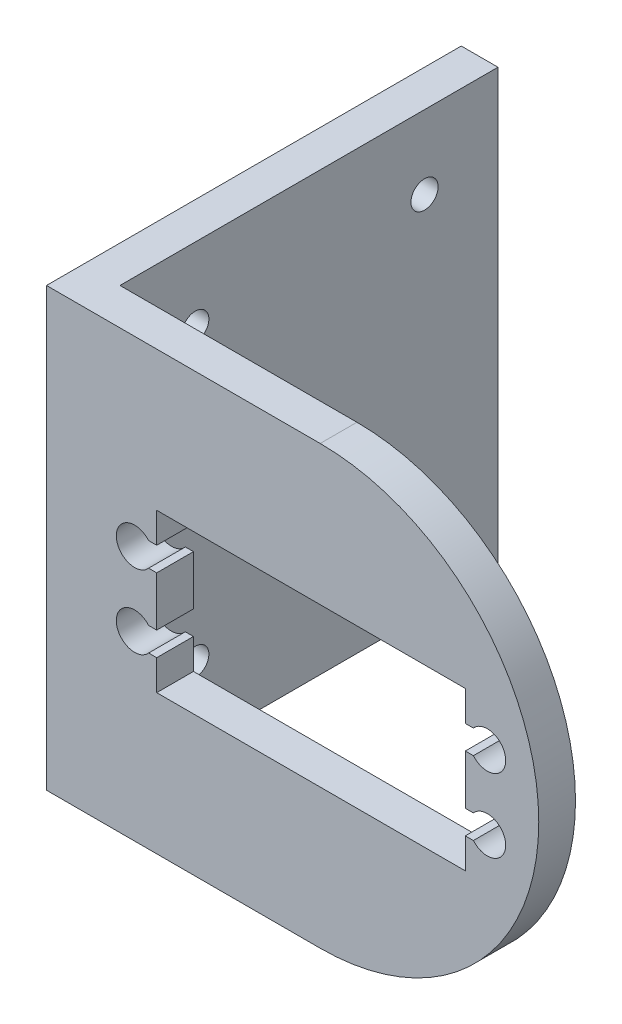
ISO-10303-21;
HEADER;
FILE_DESCRIPTION(('STEP AP214'),'2;1');
FILE_NAME('part.step','',(''),(''),'','','');
FILE_SCHEMA(('AUTOMOTIVE_DESIGN { 1 0 10303 214 1 1 1 1 }'));
ENDSEC;
DATA;
#1=APPLICATION_CONTEXT('core data for automotive mechanical design processes');
#2=APPLICATION_PROTOCOL_DEFINITION('international standard','automotive_design',2000,#1);
#3=PRODUCT_CONTEXT('',#1,'mechanical');
#4=PRODUCT('Part','Part','',(#3));
#5=PRODUCT_RELATED_PRODUCT_CATEGORY('part','',(#4));
#6=PRODUCT_DEFINITION_FORMATION('','',#4);
#7=PRODUCT_DEFINITION_CONTEXT('part definition',#1,'design');
#8=PRODUCT_DEFINITION('design','',#6,#7);
#9=PRODUCT_DEFINITION_SHAPE('','',#8);
#10=(LENGTH_UNIT() NAMED_UNIT(*) SI_UNIT(.MILLI.,.METRE.));
#11=(NAMED_UNIT(*) PLANE_ANGLE_UNIT() SI_UNIT($,.RADIAN.));
#12=(NAMED_UNIT(*) SI_UNIT($,.STERADIAN.) SOLID_ANGLE_UNIT());
#13=UNCERTAINTY_MEASURE_WITH_UNIT(LENGTH_MEASURE(1.E-05),#10,'distance_accuracy_value','');
#14=(GEOMETRIC_REPRESENTATION_CONTEXT(3) GLOBAL_UNCERTAINTY_ASSIGNED_CONTEXT((#13)) GLOBAL_UNIT_ASSIGNED_CONTEXT((#10,
#11,#12)) REPRESENTATION_CONTEXT('',''));
#15=CARTESIAN_POINT('',(0.,0.,0.));
#16=DIRECTION('',(0.,0.,1.));
#17=DIRECTION('',(1.,0.,0.));
#18=AXIS2_PLACEMENT_3D('',#15,#16,#17);
#19=CARTESIAN_POINT('',(1.25000000000001,0.,5.));
#20=DIRECTION('',(0.,0.,-1.));
#21=DIRECTION('',(-1.,0.,0.));
#22=AXIS2_PLACEMENT_3D('',#19,#20,#21);
#23=CYLINDRICAL_SURFACE('',#22,29.75);
#24=DIRECTION('',(0.,0.,-1.));
#25=VECTOR('',#24,1.);
#26=CARTESIAN_POINT('',(1.25000000000002,29.75,5.));
#27=LINE('',#26,#25);
#28=CARTESIAN_POINT('',(1.25000000000002,29.75,5.));
#29=VERTEX_POINT('',#28);
#30=CARTESIAN_POINT('',(1.25000000000004,29.75,0.));
#31=VERTEX_POINT('',#30);
#32=EDGE_CURVE('E214',#29,#31,#27,.T.);
#33=ORIENTED_EDGE('',*,*,#32,.F.);
#34=CARTESIAN_POINT('',(1.25000000000001,0.,5.));
#35=DIRECTION('',(0.,0.,1.));
#36=DIRECTION('',(1.,0.,0.));
#37=AXIS2_PLACEMENT_3D('',#34,#35,#36);
#38=CIRCLE('',#37,29.75);
#39=CARTESIAN_POINT('',(1.25000000000003,-29.75,5.));
#40=VERTEX_POINT('',#39);
#41=EDGE_CURVE('E43',#40,#29,#38,.T.);
#42=ORIENTED_EDGE('',*,*,#41,.F.);
#43=DIRECTION('',(0.,0.,-1.));
#44=VECTOR('',#43,1.);
#45=CARTESIAN_POINT('',(1.25000000000004,-29.75,5.));
#46=LINE('',#45,#44);
#47=CARTESIAN_POINT('',(1.25000000000001,-29.75,0.));
#48=VERTEX_POINT('',#47);
#49=EDGE_CURVE('E410',#48,#40,#46,.F.);
#50=ORIENTED_EDGE('',*,*,#49,.F.);
#51=CARTESIAN_POINT('',(1.25000000000001,0.,0.));
#52=DIRECTION('',(0.,0.,1.));
#53=DIRECTION('',(1.,0.,0.));
#54=AXIS2_PLACEMENT_3D('',#51,#52,#53);
#55=CIRCLE('',#54,29.75);
#56=EDGE_CURVE('E11',#31,#48,#55,.F.);
#57=ORIENTED_EDGE('',*,*,#56,.F.);
#58=EDGE_LOOP('',(#33,#42,#50,#57));
#59=FACE_BOUND('',#58,.T.);
#60=ADVANCED_FACE('F35',(#59),#23,.T.);
#61=CARTESIAN_POINT('',(0.,0.,5.));
#62=DIRECTION('',(0.,0.,1.));
#63=DIRECTION('',(1.,0.,0.));
#64=AXIS2_PLACEMENT_3D('',#61,#62,#63);
#65=PLANE('',#64);
#66=DIRECTION('',(1.,0.,0.));
#67=VECTOR('',#66,1.);
#68=CARTESIAN_POINT('',(-31.,-29.75,5.));
#69=LINE('',#68,#67);
#70=CARTESIAN_POINT('',(-36.,-29.75,5.));
#71=VERTEX_POINT('',#70);
#72=EDGE_CURVE('E215',#71,#40,#69,.T.);
#73=ORIENTED_EDGE('',*,*,#72,.T.);
#74=ORIENTED_EDGE('',*,*,#41,.T.);
#75=DIRECTION('',(-1.,0.,0.));
#76=VECTOR('',#75,1.);
#77=CARTESIAN_POINT('',(31.,29.75,5.));
#78=LINE('',#77,#76);
#79=CARTESIAN_POINT('',(-36.,29.75,5.));
#80=VERTEX_POINT('',#79);
#81=EDGE_CURVE('E205',#29,#80,#78,.T.);
#82=ORIENTED_EDGE('',*,*,#81,.T.);
#83=DIRECTION('',(0.,1.,0.));
#84=VECTOR('',#83,1.);
#85=CARTESIAN_POINT('',(-36.,29.75,5.));
#86=LINE('',#85,#84);
#87=EDGE_CURVE('E211',#71,#80,#86,.T.);
#88=ORIENTED_EDGE('',*,*,#87,.F.);
#89=EDGE_LOOP('',(#73,#74,#82,#88));
#90=FACE_BOUND('',#89,.T.);
#91=DIRECTION('',(1.,0.,0.));
#92=VECTOR('',#91,1.);
#93=CARTESIAN_POINT('',(-22.1001644808037,3.37499999999999,5.));
#94=LINE('',#93,#92);
#95=CARTESIAN_POINT('',(-22.1001644808037,3.37499999999999,5.));
#96=VERTEX_POINT('',#95);
#97=CARTESIAN_POINT('',(-21.,3.37499999999999,5.));
#98=VERTEX_POINT('',#97);
#99=EDGE_CURVE('E253',#96,#98,#94,.T.);
#100=ORIENTED_EDGE('',*,*,#99,.F.);
#101=CARTESIAN_POINT('',(-24.,5.,5.));
#102=DIRECTION('',(0.,0.,1.));
#103=DIRECTION('',(1.,0.,0.));
#104=AXIS2_PLACEMENT_3D('',#101,#102,#103);
#105=CIRCLE('',#104,2.5);
#106=CARTESIAN_POINT('',(-22.1001644808037,6.62500000000001,5.));
#107=VERTEX_POINT('',#106);
#108=EDGE_CURVE('E251',#107,#96,#105,.T.);
#109=ORIENTED_EDGE('',*,*,#108,.F.);
#110=DIRECTION('',(-1.,0.,0.));
#111=VECTOR('',#110,1.);
#112=CARTESIAN_POINT('',(-22.1001644808037,6.62500000000001,5.));
#113=LINE('',#112,#111);
#114=CARTESIAN_POINT('',(-21.,6.62500000000001,5.));
#115=VERTEX_POINT('',#114);
#116=EDGE_CURVE('E291',#115,#107,#113,.T.);
#117=ORIENTED_EDGE('',*,*,#116,.F.);
#118=DIRECTION('',(0.,-1.,0.));
#119=VECTOR('',#118,1.);
#120=CARTESIAN_POINT('',(-21.,10.75,5.));
#121=LINE('',#120,#119);
#122=CARTESIAN_POINT('',(-21.,10.75,5.));
#123=VERTEX_POINT('',#122);
#124=EDGE_CURVE('E288',#123,#115,#121,.T.);
#125=ORIENTED_EDGE('',*,*,#124,.F.);
#126=DIRECTION('',(-1.,0.,0.));
#127=VECTOR('',#126,1.);
#128=CARTESIAN_POINT('',(-21.,10.75,5.));
#129=LINE('',#128,#127);
#130=CARTESIAN_POINT('',(21.0357876746711,10.75,5.));
#131=VERTEX_POINT('',#130);
#132=EDGE_CURVE('E286',#131,#123,#129,.T.);
#133=ORIENTED_EDGE('',*,*,#132,.F.);
#134=DIRECTION('',(0.00867547342712313,0.9999623673723,0.));
#135=VECTOR('',#134,1.);
#136=CARTESIAN_POINT('',(21.0357876746711,10.75,5.));
#137=LINE('',#136,#135);
#138=CARTESIAN_POINT('',(21.,6.62500000000001,5.));
#139=VERTEX_POINT('',#138);
#140=EDGE_CURVE('E284',#139,#131,#137,.T.);
#141=ORIENTED_EDGE('',*,*,#140,.F.);
#142=DIRECTION('',(-1.,0.,0.));
#143=VECTOR('',#142,1.);
#144=CARTESIAN_POINT('',(22.1001644808037,6.62500000000001,5.));
#145=LINE('',#144,#143);
#146=CARTESIAN_POINT('',(22.1001644808037,6.62500000000001,5.));
#147=VERTEX_POINT('',#146);
#148=EDGE_CURVE('E282',#147,#139,#145,.T.);
#149=ORIENTED_EDGE('',*,*,#148,.F.);
#150=CARTESIAN_POINT('',(24.,5.,5.));
#151=DIRECTION('',(0.,0.,1.));
#152=DIRECTION('',(-1.,0.,0.));
#153=AXIS2_PLACEMENT_3D('',#150,#151,#152);
#154=CIRCLE('',#153,2.5);
#155=CARTESIAN_POINT('',(22.1001644808037,3.37499999999999,5.));
#156=VERTEX_POINT('',#155);
#157=EDGE_CURVE('E280',#156,#147,#154,.T.);
#158=ORIENTED_EDGE('',*,*,#157,.F.);
#159=DIRECTION('',(1.,0.,0.));
#160=VECTOR('',#159,1.);
#161=CARTESIAN_POINT('',(22.1001644808037,3.37499999999999,5.));
#162=LINE('',#161,#160);
#163=CARTESIAN_POINT('',(21.,3.37499999999999,5.));
#164=VERTEX_POINT('',#163);
#165=EDGE_CURVE('E278',#164,#156,#162,.T.);
#166=ORIENTED_EDGE('',*,*,#165,.F.);
#167=DIRECTION('',(0.,1.,0.));
#168=VECTOR('',#167,1.);
#169=CARTESIAN_POINT('',(21.,3.37499999999999,5.));
#170=LINE('',#169,#168);
#171=CARTESIAN_POINT('',(21.,-3.37499999999998,5.));
#172=VERTEX_POINT('',#171);
#173=EDGE_CURVE('E276',#172,#164,#170,.T.);
#174=ORIENTED_EDGE('',*,*,#173,.F.);
#175=DIRECTION('',(-1.,0.,0.));
#176=VECTOR('',#175,1.);
#177=CARTESIAN_POINT('',(22.1001644808037,-3.37499999999998,5.));
#178=LINE('',#177,#176);
#179=CARTESIAN_POINT('',(22.1001644808037,-3.37499999999998,5.));
#180=VERTEX_POINT('',#179);
#181=EDGE_CURVE('E274',#180,#172,#178,.T.);
#182=ORIENTED_EDGE('',*,*,#181,.F.);
#183=CARTESIAN_POINT('',(24.,-4.99999999999999,5.));
#184=DIRECTION('',(0.,0.,1.));
#185=DIRECTION('',(1.,0.,0.));
#186=AXIS2_PLACEMENT_3D('',#183,#184,#185);
#187=CIRCLE('',#186,2.5);
#188=CARTESIAN_POINT('',(22.1001644808037,-6.625,5.));
#189=VERTEX_POINT('',#188);
#190=EDGE_CURVE('E272',#189,#180,#187,.T.);
#191=ORIENTED_EDGE('',*,*,#190,.F.);
#192=DIRECTION('',(1.,0.,0.));
#193=VECTOR('',#192,1.);
#194=CARTESIAN_POINT('',(22.1001644808037,-6.625,5.));
#195=LINE('',#194,#193);
#196=CARTESIAN_POINT('',(21.,-6.62499999999999,5.));
#197=VERTEX_POINT('',#196);
#198=EDGE_CURVE('E270',#197,#189,#195,.T.);
#199=ORIENTED_EDGE('',*,*,#198,.F.);
#200=DIRECTION('',(0.,1.,0.));
#201=VECTOR('',#200,1.);
#202=CARTESIAN_POINT('',(21.,-6.62499999999999,5.));
#203=LINE('',#202,#201);
#204=CARTESIAN_POINT('',(21.,-10.75,5.));
#205=VERTEX_POINT('',#204);
#206=EDGE_CURVE('E268',#205,#197,#203,.T.);
#207=ORIENTED_EDGE('',*,*,#206,.F.);
#208=DIRECTION('',(1.,0.,0.));
#209=VECTOR('',#208,1.);
#210=CARTESIAN_POINT('',(-21.,-10.75,5.));
#211=LINE('',#210,#209);
#212=CARTESIAN_POINT('',(-21.,-10.75,5.));
#213=VERTEX_POINT('',#212);
#214=EDGE_CURVE('E266',#213,#205,#211,.T.);
#215=ORIENTED_EDGE('',*,*,#214,.F.);
#216=DIRECTION('',(0.,-1.,0.));
#217=VECTOR('',#216,1.);
#218=CARTESIAN_POINT('',(-21.,-6.62499999999999,5.));
#219=LINE('',#218,#217);
#220=CARTESIAN_POINT('',(-21.,-6.62499999999999,5.));
#221=VERTEX_POINT('',#220);
#222=EDGE_CURVE('E264',#221,#213,#219,.T.);
#223=ORIENTED_EDGE('',*,*,#222,.F.);
#224=DIRECTION('',(1.,0.,0.));
#225=VECTOR('',#224,1.);
#226=CARTESIAN_POINT('',(-22.1001644808037,-6.625,5.));
#227=LINE('',#226,#225);
#228=CARTESIAN_POINT('',(-22.1001644808037,-6.625,5.));
#229=VERTEX_POINT('',#228);
#230=EDGE_CURVE('E262',#229,#221,#227,.T.);
#231=ORIENTED_EDGE('',*,*,#230,.F.);
#232=CARTESIAN_POINT('',(-24.,-4.99999999999999,5.));
#233=DIRECTION('',(0.,0.,1.));
#234=DIRECTION('',(-1.,0.,0.));
#235=AXIS2_PLACEMENT_3D('',#232,#233,#234);
#236=CIRCLE('',#235,2.5);
#237=CARTESIAN_POINT('',(-22.1001644808037,-3.37499999999998,5.));
#238=VERTEX_POINT('',#237);
#239=EDGE_CURVE('E260',#238,#229,#236,.T.);
#240=ORIENTED_EDGE('',*,*,#239,.F.);
#241=DIRECTION('',(-1.,0.,0.));
#242=VECTOR('',#241,1.);
#243=CARTESIAN_POINT('',(-22.1001644808037,-3.37499999999998,5.));
#244=LINE('',#243,#242);
#245=CARTESIAN_POINT('',(-21.,-3.37499999999998,5.));
#246=VERTEX_POINT('',#245);
#247=EDGE_CURVE('E258',#246,#238,#244,.T.);
#248=ORIENTED_EDGE('',*,*,#247,.F.);
#249=DIRECTION('',(0.,-1.,0.));
#250=VECTOR('',#249,1.);
#251=CARTESIAN_POINT('',(-21.,3.37499999999999,5.));
#252=LINE('',#251,#250);
#253=EDGE_CURVE('E256',#98,#246,#252,.T.);
#254=ORIENTED_EDGE('',*,*,#253,.F.);
#255=EDGE_LOOP('',(#100,#109,#117,#125,#133,#141,#149,#158,#166,#174,#182,#191,#199,#207,#215,
#223,#231,#240,#248,#254));
#256=FACE_BOUND('',#255,.T.);
#257=ADVANCED_FACE('F208',(#90,#256),#65,.T.);
#258=CARTESIAN_POINT('',(0.,0.,0.));
#259=DIRECTION('',(0.,0.,1.));
#260=DIRECTION('',(1.,0.,0.));
#261=AXIS2_PLACEMENT_3D('',#258,#259,#260);
#262=PLANE('',#261);
#263=DIRECTION('',(-1.,0.,0.));
#264=VECTOR('',#263,1.);
#265=CARTESIAN_POINT('',(-31.,29.75,0.));
#266=LINE('',#265,#264);
#267=CARTESIAN_POINT('',(-31.,29.75,0.));
#268=VERTEX_POINT('',#267);
#269=EDGE_CURVE('E395',#31,#268,#266,.T.);
#270=ORIENTED_EDGE('',*,*,#269,.F.);
#271=ORIENTED_EDGE('',*,*,#56,.T.);
#272=DIRECTION('',(1.,0.,0.));
#273=VECTOR('',#272,1.);
#274=CARTESIAN_POINT('',(31.,-29.75,0.));
#275=LINE('',#274,#273);
#276=CARTESIAN_POINT('',(-31.,-29.75,0.));
#277=VERTEX_POINT('',#276);
#278=EDGE_CURVE('E401',#277,#48,#275,.T.);
#279=ORIENTED_EDGE('',*,*,#278,.F.);
#280=DIRECTION('',(0.,-1.,0.));
#281=VECTOR('',#280,1.);
#282=CARTESIAN_POINT('',(-31.,29.75,0.));
#283=LINE('',#282,#281);
#284=EDGE_CURVE('E394',#268,#277,#283,.T.);
#285=ORIENTED_EDGE('',*,*,#284,.F.);
#286=EDGE_LOOP('',(#270,#271,#279,#285));
#287=FACE_BOUND('',#286,.T.);
#288=CARTESIAN_POINT('',(-24.,5.,0.));
#289=DIRECTION('',(0.,0.,1.));
#290=DIRECTION('',(1.,0.,0.));
#291=AXIS2_PLACEMENT_3D('',#288,#289,#290);
#292=CIRCLE('',#291,2.5);
#293=CARTESIAN_POINT('',(-22.1001644808037,6.62500000000001,0.));
#294=VERTEX_POINT('',#293);
#295=CARTESIAN_POINT('',(-22.1001644808037,3.37499999999999,0.));
#296=VERTEX_POINT('',#295);
#297=EDGE_CURVE('E294',#294,#296,#292,.T.);
#298=ORIENTED_EDGE('',*,*,#297,.T.);
#299=DIRECTION('',(1.,0.,0.));
#300=VECTOR('',#299,1.);
#301=CARTESIAN_POINT('',(-22.1001644808037,3.37499999999999,0.));
#302=LINE('',#301,#300);
#303=CARTESIAN_POINT('',(-21.,3.37499999999999,0.));
#304=VERTEX_POINT('',#303);
#305=EDGE_CURVE('E297',#296,#304,#302,.T.);
#306=ORIENTED_EDGE('',*,*,#305,.T.);
#307=DIRECTION('',(0.,-1.,0.));
#308=VECTOR('',#307,1.);
#309=CARTESIAN_POINT('',(-21.,3.37499999999999,0.));
#310=LINE('',#309,#308);
#311=CARTESIAN_POINT('',(-21.,-3.37499999999998,0.));
#312=VERTEX_POINT('',#311);
#313=EDGE_CURVE('E300',#304,#312,#310,.T.);
#314=ORIENTED_EDGE('',*,*,#313,.T.);
#315=DIRECTION('',(-1.,0.,0.));
#316=VECTOR('',#315,1.);
#317=CARTESIAN_POINT('',(-22.1001644808037,-3.37499999999998,0.));
#318=LINE('',#317,#316);
#319=CARTESIAN_POINT('',(-22.1001644808037,-3.37499999999998,0.));
#320=VERTEX_POINT('',#319);
#321=EDGE_CURVE('E303',#312,#320,#318,.T.);
#322=ORIENTED_EDGE('',*,*,#321,.T.);
#323=CARTESIAN_POINT('',(-24.,-4.99999999999999,0.));
#324=DIRECTION('',(0.,0.,1.));
#325=DIRECTION('',(-1.,0.,0.));
#326=AXIS2_PLACEMENT_3D('',#323,#324,#325);
#327=CIRCLE('',#326,2.5);
#328=CARTESIAN_POINT('',(-22.1001644808037,-6.625,0.));
#329=VERTEX_POINT('',#328);
#330=EDGE_CURVE('E306',#320,#329,#327,.T.);
#331=ORIENTED_EDGE('',*,*,#330,.T.);
#332=DIRECTION('',(1.,0.,0.));
#333=VECTOR('',#332,1.);
#334=CARTESIAN_POINT('',(-22.1001644808037,-6.625,0.));
#335=LINE('',#334,#333);
#336=CARTESIAN_POINT('',(-21.,-6.62499999999999,0.));
#337=VERTEX_POINT('',#336);
#338=EDGE_CURVE('E309',#329,#337,#335,.T.);
#339=ORIENTED_EDGE('',*,*,#338,.T.);
#340=DIRECTION('',(0.,-1.,0.));
#341=VECTOR('',#340,1.);
#342=CARTESIAN_POINT('',(-21.,-6.62499999999999,0.));
#343=LINE('',#342,#341);
#344=CARTESIAN_POINT('',(-21.,-10.75,0.));
#345=VERTEX_POINT('',#344);
#346=EDGE_CURVE('E312',#337,#345,#343,.T.);
#347=ORIENTED_EDGE('',*,*,#346,.T.);
#348=DIRECTION('',(1.,0.,0.));
#349=VECTOR('',#348,1.);
#350=CARTESIAN_POINT('',(-21.,-10.75,0.));
#351=LINE('',#350,#349);
#352=CARTESIAN_POINT('',(21.,-10.75,0.));
#353=VERTEX_POINT('',#352);
#354=EDGE_CURVE('E315',#345,#353,#351,.T.);
#355=ORIENTED_EDGE('',*,*,#354,.T.);
#356=DIRECTION('',(0.,1.,0.));
#357=VECTOR('',#356,1.);
#358=CARTESIAN_POINT('',(21.,-6.62499999999999,0.));
#359=LINE('',#358,#357);
#360=CARTESIAN_POINT('',(21.,-6.62499999999999,0.));
#361=VERTEX_POINT('',#360);
#362=EDGE_CURVE('E318',#353,#361,#359,.T.);
#363=ORIENTED_EDGE('',*,*,#362,.T.);
#364=DIRECTION('',(1.,0.,0.));
#365=VECTOR('',#364,1.);
#366=CARTESIAN_POINT('',(22.1001644808037,-6.625,0.));
#367=LINE('',#366,#365);
#368=CARTESIAN_POINT('',(22.1001644808037,-6.625,0.));
#369=VERTEX_POINT('',#368);
#370=EDGE_CURVE('E321',#361,#369,#367,.T.);
#371=ORIENTED_EDGE('',*,*,#370,.T.);
#372=CARTESIAN_POINT('',(24.,-4.99999999999999,0.));
#373=DIRECTION('',(0.,0.,1.));
#374=DIRECTION('',(1.,0.,0.));
#375=AXIS2_PLACEMENT_3D('',#372,#373,#374);
#376=CIRCLE('',#375,2.5);
#377=CARTESIAN_POINT('',(22.1001644808037,-3.37499999999998,0.));
#378=VERTEX_POINT('',#377);
#379=EDGE_CURVE('E324',#369,#378,#376,.T.);
#380=ORIENTED_EDGE('',*,*,#379,.T.);
#381=DIRECTION('',(-1.,0.,0.));
#382=VECTOR('',#381,1.);
#383=CARTESIAN_POINT('',(22.1001644808037,-3.37499999999998,0.));
#384=LINE('',#383,#382);
#385=CARTESIAN_POINT('',(21.,-3.37499999999998,0.));
#386=VERTEX_POINT('',#385);
#387=EDGE_CURVE('E327',#378,#386,#384,.T.);
#388=ORIENTED_EDGE('',*,*,#387,.T.);
#389=DIRECTION('',(0.,1.,0.));
#390=VECTOR('',#389,1.);
#391=CARTESIAN_POINT('',(21.,3.37499999999999,0.));
#392=LINE('',#391,#390);
#393=CARTESIAN_POINT('',(21.,3.37499999999999,0.));
#394=VERTEX_POINT('',#393);
#395=EDGE_CURVE('E330',#386,#394,#392,.T.);
#396=ORIENTED_EDGE('',*,*,#395,.T.);
#397=DIRECTION('',(1.,0.,0.));
#398=VECTOR('',#397,1.);
#399=CARTESIAN_POINT('',(22.1001644808037,3.37499999999999,0.));
#400=LINE('',#399,#398);
#401=CARTESIAN_POINT('',(22.1001644808037,3.37499999999999,0.));
#402=VERTEX_POINT('',#401);
#403=EDGE_CURVE('E333',#394,#402,#400,.T.);
#404=ORIENTED_EDGE('',*,*,#403,.T.);
#405=CARTESIAN_POINT('',(24.,5.,0.));
#406=DIRECTION('',(0.,0.,1.));
#407=DIRECTION('',(-1.,0.,0.));
#408=AXIS2_PLACEMENT_3D('',#405,#406,#407);
#409=CIRCLE('',#408,2.5);
#410=CARTESIAN_POINT('',(22.1001644808037,6.62500000000001,0.));
#411=VERTEX_POINT('',#410);
#412=EDGE_CURVE('E336',#402,#411,#409,.T.);
#413=ORIENTED_EDGE('',*,*,#412,.T.);
#414=DIRECTION('',(-1.,0.,0.));
#415=VECTOR('',#414,1.);
#416=CARTESIAN_POINT('',(22.1001644808037,6.62500000000001,0.));
#417=LINE('',#416,#415);
#418=CARTESIAN_POINT('',(21.,6.62500000000001,0.));
#419=VERTEX_POINT('',#418);
#420=EDGE_CURVE('E339',#411,#419,#417,.T.);
#421=ORIENTED_EDGE('',*,*,#420,.T.);
#422=DIRECTION('',(0.00867547342712313,0.9999623673723,0.));
#423=VECTOR('',#422,1.);
#424=CARTESIAN_POINT('',(21.0357876746711,10.75,0.));
#425=LINE('',#424,#423);
#426=CARTESIAN_POINT('',(21.0357876746711,10.75,0.));
#427=VERTEX_POINT('',#426);
#428=EDGE_CURVE('E342',#419,#427,#425,.T.);
#429=ORIENTED_EDGE('',*,*,#428,.T.);
#430=DIRECTION('',(-1.,0.,0.));
#431=VECTOR('',#430,1.);
#432=CARTESIAN_POINT('',(-21.,10.75,0.));
#433=LINE('',#432,#431);
#434=CARTESIAN_POINT('',(-21.,10.75,0.));
#435=VERTEX_POINT('',#434);
#436=EDGE_CURVE('E345',#427,#435,#433,.T.);
#437=ORIENTED_EDGE('',*,*,#436,.T.);
#438=DIRECTION('',(0.,-1.,0.));
#439=VECTOR('',#438,1.);
#440=CARTESIAN_POINT('',(-21.,10.75,0.));
#441=LINE('',#440,#439);
#442=CARTESIAN_POINT('',(-21.,6.62500000000001,0.));
#443=VERTEX_POINT('',#442);
#444=EDGE_CURVE('E348',#435,#443,#441,.T.);
#445=ORIENTED_EDGE('',*,*,#444,.T.);
#446=DIRECTION('',(-1.,0.,0.));
#447=VECTOR('',#446,1.);
#448=CARTESIAN_POINT('',(-22.1001644808037,6.62500000000001,0.));
#449=LINE('',#448,#447);
#450=EDGE_CURVE('E254',#443,#294,#449,.T.);
#451=ORIENTED_EDGE('',*,*,#450,.T.);
#452=EDGE_LOOP('',(#298,#306,#314,#322,#331,#339,#347,#355,#363,#371,#380,#388,#396,#404,#413,
#421,#429,#437,#445,#451));
#453=FACE_BOUND('',#452,.T.);
#454=ADVANCED_FACE('F414',(#287,#453),#262,.F.);
#455=CARTESIAN_POINT('',(31.,-29.75,5.));
#456=DIRECTION('',(0.,1.,0.));
#457=DIRECTION('',(-1.,0.,0.));
#458=AXIS2_PLACEMENT_3D('',#455,#456,#457);
#459=PLANE('',#458);
#460=ORIENTED_EDGE('',*,*,#278,.T.);
#461=ORIENTED_EDGE('',*,*,#49,.T.);
#462=ORIENTED_EDGE('',*,*,#72,.F.);
#463=DIRECTION('',(0.,0.,1.));
#464=VECTOR('',#463,1.);
#465=CARTESIAN_POINT('',(-36.,-29.75,5.));
#466=LINE('',#465,#464);
#467=CARTESIAN_POINT('',(-36.,-29.75,-51.45));
#468=VERTEX_POINT('',#467);
#469=EDGE_CURVE('E230',#468,#71,#466,.T.);
#470=ORIENTED_EDGE('',*,*,#469,.F.);
#471=DIRECTION('',(1.,0.,0.));
#472=VECTOR('',#471,1.);
#473=CARTESIAN_POINT('',(-36.,-29.75,-51.45));
#474=LINE('',#473,#472);
#475=CARTESIAN_POINT('',(-31.,-29.75,-51.45));
#476=VERTEX_POINT('',#475);
#477=EDGE_CURVE('E242',#468,#476,#474,.T.);
#478=ORIENTED_EDGE('',*,*,#477,.T.);
#479=DIRECTION('',(0.,0.,1.));
#480=VECTOR('',#479,1.);
#481=CARTESIAN_POINT('',(-31.,-29.75,5.));
#482=LINE('',#481,#480);
#483=EDGE_CURVE('E231',#476,#277,#482,.T.);
#484=ORIENTED_EDGE('',*,*,#483,.T.);
#485=EDGE_LOOP('',(#460,#461,#462,#470,#478,#484));
#486=FACE_BOUND('',#485,.T.);
#487=ADVANCED_FACE('F412',(#486),#459,.F.);
#488=CARTESIAN_POINT('',(-31.,29.75,5.));
#489=DIRECTION('',(0.,-1.,0.));
#490=DIRECTION('',(1.,0.,0.));
#491=AXIS2_PLACEMENT_3D('',#488,#489,#490);
#492=PLANE('',#491);
#493=ORIENTED_EDGE('',*,*,#81,.F.);
#494=ORIENTED_EDGE('',*,*,#32,.T.);
#495=ORIENTED_EDGE('',*,*,#269,.T.);
#496=DIRECTION('',(0.,0.,-1.));
#497=VECTOR('',#496,1.);
#498=CARTESIAN_POINT('',(-31.,29.75,5.));
#499=LINE('',#498,#497);
#500=CARTESIAN_POINT('',(-31.,29.75,-51.45));
#501=VERTEX_POINT('',#500);
#502=EDGE_CURVE('E247',#268,#501,#499,.T.);
#503=ORIENTED_EDGE('',*,*,#502,.T.);
#504=DIRECTION('',(1.,0.,0.));
#505=VECTOR('',#504,1.);
#506=CARTESIAN_POINT('',(-36.,29.75,-51.45));
#507=LINE('',#506,#505);
#508=CARTESIAN_POINT('',(-36.,29.75,-51.45));
#509=VERTEX_POINT('',#508);
#510=EDGE_CURVE('E221',#509,#501,#507,.T.);
#511=ORIENTED_EDGE('',*,*,#510,.F.);
#512=DIRECTION('',(0.,0.,-1.));
#513=VECTOR('',#512,1.);
#514=CARTESIAN_POINT('',(-36.,29.75,5.));
#515=LINE('',#514,#513);
#516=EDGE_CURVE('E218',#80,#509,#515,.T.);
#517=ORIENTED_EDGE('',*,*,#516,.F.);
#518=EDGE_LOOP('',(#493,#494,#495,#503,#511,#517));
#519=FACE_BOUND('',#518,.T.);
#520=ADVANCED_FACE('F219',(#519),#492,.F.);
#521=CARTESIAN_POINT('',(-24.,5.,5.));
#522=DIRECTION('',(0.,0.,-1.));
#523=DIRECTION('',(-1.,0.,0.));
#524=AXIS2_PLACEMENT_3D('',#521,#522,#523);
#525=CYLINDRICAL_SURFACE('',#524,2.5);
#526=ORIENTED_EDGE('',*,*,#297,.F.);
#527=DIRECTION('',(0.,0.,-1.));
#528=VECTOR('',#527,1.);
#529=CARTESIAN_POINT('',(-22.1001644808037,6.62500000000001,5.));
#530=LINE('',#529,#528);
#531=EDGE_CURVE('E293',#107,#294,#530,.T.);
#532=ORIENTED_EDGE('',*,*,#531,.F.);
#533=ORIENTED_EDGE('',*,*,#108,.T.);
#534=DIRECTION('',(0.,0.,-1.));
#535=VECTOR('',#534,1.);
#536=CARTESIAN_POINT('',(-22.1001644808037,3.37499999999999,5.));
#537=LINE('',#536,#535);
#538=EDGE_CURVE('E391',#96,#296,#537,.T.);
#539=ORIENTED_EDGE('',*,*,#538,.T.);
#540=EDGE_LOOP('',(#526,#532,#533,#539));
#541=FACE_BOUND('',#540,.T.);
#542=ADVANCED_FACE('F453',(#541),#525,.F.);
#543=CARTESIAN_POINT('',(-22.1001644808037,3.37499999999999,5.));
#544=DIRECTION('',(0.,1.,0.));
#545=DIRECTION('',(0.,0.,1.));
#546=AXIS2_PLACEMENT_3D('',#543,#544,#545);
#547=PLANE('',#546);
#548=ORIENTED_EDGE('',*,*,#305,.F.);
#549=ORIENTED_EDGE('',*,*,#538,.F.);
#550=ORIENTED_EDGE('',*,*,#99,.T.);
#551=DIRECTION('',(0.,0.,-1.));
#552=VECTOR('',#551,1.);
#553=CARTESIAN_POINT('',(-21.,3.37499999999999,5.));
#554=LINE('',#553,#552);
#555=EDGE_CURVE('E389',#98,#304,#554,.T.);
#556=ORIENTED_EDGE('',*,*,#555,.T.);
#557=EDGE_LOOP('',(#548,#549,#550,#556));
#558=FACE_BOUND('',#557,.T.);
#559=ADVANCED_FACE('F539',(#558),#547,.T.);
#560=CARTESIAN_POINT('',(-21.,3.37499999999999,5.));
#561=DIRECTION('',(1.,0.,0.));
#562=DIRECTION('',(0.,0.,-1.));
#563=AXIS2_PLACEMENT_3D('',#560,#561,#562);
#564=PLANE('',#563);
#565=ORIENTED_EDGE('',*,*,#313,.F.);
#566=ORIENTED_EDGE('',*,*,#555,.F.);
#567=ORIENTED_EDGE('',*,*,#253,.T.);
#568=DIRECTION('',(0.,0.,-1.));
#569=VECTOR('',#568,1.);
#570=CARTESIAN_POINT('',(-21.,-3.37499999999998,5.));
#571=LINE('',#570,#569);
#572=EDGE_CURVE('E387',#246,#312,#571,.T.);
#573=ORIENTED_EDGE('',*,*,#572,.T.);
#574=EDGE_LOOP('',(#565,#566,#567,#573));
#575=FACE_BOUND('',#574,.T.);
#576=ADVANCED_FACE('F546',(#575),#564,.T.);
#577=CARTESIAN_POINT('',(-22.1001644808037,-3.37499999999998,5.));
#578=DIRECTION('',(0.,-1.,0.));
#579=DIRECTION('',(1.,0.,0.));
#580=AXIS2_PLACEMENT_3D('',#577,#578,#579);
#581=PLANE('',#580);
#582=ORIENTED_EDGE('',*,*,#321,.F.);
#583=ORIENTED_EDGE('',*,*,#572,.F.);
#584=ORIENTED_EDGE('',*,*,#247,.T.);
#585=DIRECTION('',(0.,0.,-1.));
#586=VECTOR('',#585,1.);
#587=CARTESIAN_POINT('',(-22.1001644808037,-3.37499999999998,5.));
#588=LINE('',#587,#586);
#589=EDGE_CURVE('E385',#238,#320,#588,.T.);
#590=ORIENTED_EDGE('',*,*,#589,.T.);
#591=EDGE_LOOP('',(#582,#583,#584,#590));
#592=FACE_BOUND('',#591,.T.);
#593=ADVANCED_FACE('F553',(#592),#581,.T.);
#594=CARTESIAN_POINT('',(-24.,-4.99999999999999,5.));
#595=DIRECTION('',(0.,0.,-1.));
#596=DIRECTION('',(-1.,0.,0.));
#597=AXIS2_PLACEMENT_3D('',#594,#595,#596);
#598=CYLINDRICAL_SURFACE('',#597,2.5);
#599=ORIENTED_EDGE('',*,*,#330,.F.);
#600=ORIENTED_EDGE('',*,*,#589,.F.);
#601=ORIENTED_EDGE('',*,*,#239,.T.);
#602=DIRECTION('',(0.,0.,-1.));
#603=VECTOR('',#602,1.);
#604=CARTESIAN_POINT('',(-22.1001644808037,-6.625,5.));
#605=LINE('',#604,#603);
#606=EDGE_CURVE('E383',#229,#329,#605,.T.);
#607=ORIENTED_EDGE('',*,*,#606,.T.);
#608=EDGE_LOOP('',(#599,#600,#601,#607));
#609=FACE_BOUND('',#608,.T.);
#610=ADVANCED_FACE('F561',(#609),#598,.F.);
#611=CARTESIAN_POINT('',(-22.1001644808037,-6.625,5.));
#612=DIRECTION('',(0.,1.,0.));
#613=DIRECTION('',(-1.,0.,0.));
#614=AXIS2_PLACEMENT_3D('',#611,#612,#613);
#615=PLANE('',#614);
#616=ORIENTED_EDGE('',*,*,#338,.F.);
#617=ORIENTED_EDGE('',*,*,#606,.F.);
#618=ORIENTED_EDGE('',*,*,#230,.T.);
#619=DIRECTION('',(0.,0.,-1.));
#620=VECTOR('',#619,1.);
#621=CARTESIAN_POINT('',(-21.,-6.62499999999999,5.));
#622=LINE('',#621,#620);
#623=EDGE_CURVE('E381',#221,#337,#622,.T.);
#624=ORIENTED_EDGE('',*,*,#623,.T.);
#625=EDGE_LOOP('',(#616,#617,#618,#624));
#626=FACE_BOUND('',#625,.T.);
#627=ADVANCED_FACE('F569',(#626),#615,.T.);
#628=CARTESIAN_POINT('',(-21.,-6.62499999999999,5.));
#629=DIRECTION('',(1.,0.,0.));
#630=DIRECTION('',(0.,0.,-1.));
#631=AXIS2_PLACEMENT_3D('',#628,#629,#630);
#632=PLANE('',#631);
#633=ORIENTED_EDGE('',*,*,#346,.F.);
#634=ORIENTED_EDGE('',*,*,#623,.F.);
#635=ORIENTED_EDGE('',*,*,#222,.T.);
#636=DIRECTION('',(0.,0.,-1.));
#637=VECTOR('',#636,1.);
#638=CARTESIAN_POINT('',(-21.,-10.75,5.));
#639=LINE('',#638,#637);
#640=EDGE_CURVE('E379',#213,#345,#639,.T.);
#641=ORIENTED_EDGE('',*,*,#640,.T.);
#642=EDGE_LOOP('',(#633,#634,#635,#641));
#643=FACE_BOUND('',#642,.T.);
#644=ADVANCED_FACE('F577',(#643),#632,.T.);
#645=CARTESIAN_POINT('',(-21.,-10.75,5.));
#646=DIRECTION('',(0.,1.,0.));
#647=DIRECTION('',(-1.,0.,0.));
#648=AXIS2_PLACEMENT_3D('',#645,#646,#647);
#649=PLANE('',#648);
#650=ORIENTED_EDGE('',*,*,#354,.F.);
#651=ORIENTED_EDGE('',*,*,#640,.F.);
#652=ORIENTED_EDGE('',*,*,#214,.T.);
#653=DIRECTION('',(0.,0.,-1.));
#654=VECTOR('',#653,1.);
#655=CARTESIAN_POINT('',(21.,-10.75,5.));
#656=LINE('',#655,#654);
#657=EDGE_CURVE('E377',#205,#353,#656,.T.);
#658=ORIENTED_EDGE('',*,*,#657,.T.);
#659=EDGE_LOOP('',(#650,#651,#652,#658));
#660=FACE_BOUND('',#659,.T.);
#661=ADVANCED_FACE('F585',(#660),#649,.T.);
#662=CARTESIAN_POINT('',(21.,-6.62499999999999,5.));
#663=DIRECTION('',(-1.,0.,0.));
#664=DIRECTION('',(0.,-1.,0.));
#665=AXIS2_PLACEMENT_3D('',#662,#663,#664);
#666=PLANE('',#665);
#667=ORIENTED_EDGE('',*,*,#362,.F.);
#668=ORIENTED_EDGE('',*,*,#657,.F.);
#669=ORIENTED_EDGE('',*,*,#206,.T.);
#670=DIRECTION('',(0.,0.,-1.));
#671=VECTOR('',#670,1.);
#672=CARTESIAN_POINT('',(21.,-6.62499999999999,5.));
#673=LINE('',#672,#671);
#674=EDGE_CURVE('E375',#197,#361,#673,.T.);
#675=ORIENTED_EDGE('',*,*,#674,.T.);
#676=EDGE_LOOP('',(#667,#668,#669,#675));
#677=FACE_BOUND('',#676,.T.);
#678=ADVANCED_FACE('F593',(#677),#666,.T.);
#679=CARTESIAN_POINT('',(22.1001644808037,-6.625,5.));
#680=DIRECTION('',(0.,1.,0.));
#681=DIRECTION('',(-1.,0.,0.));
#682=AXIS2_PLACEMENT_3D('',#679,#680,#681);
#683=PLANE('',#682);
#684=ORIENTED_EDGE('',*,*,#370,.F.);
#685=ORIENTED_EDGE('',*,*,#674,.F.);
#686=ORIENTED_EDGE('',*,*,#198,.T.);
#687=DIRECTION('',(0.,0.,-1.));
#688=VECTOR('',#687,1.);
#689=CARTESIAN_POINT('',(22.1001644808037,-6.625,5.));
#690=LINE('',#689,#688);
#691=EDGE_CURVE('E373',#189,#369,#690,.T.);
#692=ORIENTED_EDGE('',*,*,#691,.T.);
#693=EDGE_LOOP('',(#684,#685,#686,#692));
#694=FACE_BOUND('',#693,.T.);
#695=ADVANCED_FACE('F601',(#694),#683,.T.);
#696=CARTESIAN_POINT('',(24.,-4.99999999999999,5.));
#697=DIRECTION('',(0.,0.,-1.));
#698=DIRECTION('',(-1.,0.,0.));
#699=AXIS2_PLACEMENT_3D('',#696,#697,#698);
#700=CYLINDRICAL_SURFACE('',#699,2.5);
#701=ORIENTED_EDGE('',*,*,#379,.F.);
#702=ORIENTED_EDGE('',*,*,#691,.F.);
#703=ORIENTED_EDGE('',*,*,#190,.T.);
#704=DIRECTION('',(0.,0.,-1.));
#705=VECTOR('',#704,1.);
#706=CARTESIAN_POINT('',(22.1001644808037,-3.37499999999998,5.));
#707=LINE('',#706,#705);
#708=EDGE_CURVE('E371',#180,#378,#707,.T.);
#709=ORIENTED_EDGE('',*,*,#708,.T.);
#710=EDGE_LOOP('',(#701,#702,#703,#709));
#711=FACE_BOUND('',#710,.T.);
#712=ADVANCED_FACE('F609',(#711),#700,.F.);
#713=CARTESIAN_POINT('',(22.1001644808037,-3.37499999999998,5.));
#714=DIRECTION('',(0.,-1.,0.));
#715=DIRECTION('',(1.,0.,0.));
#716=AXIS2_PLACEMENT_3D('',#713,#714,#715);
#717=PLANE('',#716);
#718=ORIENTED_EDGE('',*,*,#387,.F.);
#719=ORIENTED_EDGE('',*,*,#708,.F.);
#720=ORIENTED_EDGE('',*,*,#181,.T.);
#721=DIRECTION('',(0.,0.,-1.));
#722=VECTOR('',#721,1.);
#723=CARTESIAN_POINT('',(21.,-3.37499999999998,5.));
#724=LINE('',#723,#722);
#725=EDGE_CURVE('E369',#172,#386,#724,.T.);
#726=ORIENTED_EDGE('',*,*,#725,.T.);
#727=EDGE_LOOP('',(#718,#719,#720,#726));
#728=FACE_BOUND('',#727,.T.);
#729=ADVANCED_FACE('F617',(#728),#717,.T.);
#730=CARTESIAN_POINT('',(21.,3.37499999999999,5.));
#731=DIRECTION('',(-1.,0.,0.));
#732=DIRECTION('',(0.,0.,1.));
#733=AXIS2_PLACEMENT_3D('',#730,#731,#732);
#734=PLANE('',#733);
#735=ORIENTED_EDGE('',*,*,#395,.F.);
#736=ORIENTED_EDGE('',*,*,#725,.F.);
#737=ORIENTED_EDGE('',*,*,#173,.T.);
#738=DIRECTION('',(0.,0.,-1.));
#739=VECTOR('',#738,1.);
#740=CARTESIAN_POINT('',(21.,3.37499999999999,5.));
#741=LINE('',#740,#739);
#742=EDGE_CURVE('E367',#164,#394,#741,.T.);
#743=ORIENTED_EDGE('',*,*,#742,.T.);
#744=EDGE_LOOP('',(#735,#736,#737,#743));
#745=FACE_BOUND('',#744,.T.);
#746=ADVANCED_FACE('F625',(#745),#734,.T.);
#747=CARTESIAN_POINT('',(22.1001644808037,3.37499999999999,5.));
#748=DIRECTION('',(0.,1.,0.));
#749=DIRECTION('',(0.,0.,1.));
#750=AXIS2_PLACEMENT_3D('',#747,#748,#749);
#751=PLANE('',#750);
#752=ORIENTED_EDGE('',*,*,#403,.F.);
#753=ORIENTED_EDGE('',*,*,#742,.F.);
#754=ORIENTED_EDGE('',*,*,#165,.T.);
#755=DIRECTION('',(0.,0.,-1.));
#756=VECTOR('',#755,1.);
#757=CARTESIAN_POINT('',(22.1001644808037,3.37499999999999,5.));
#758=LINE('',#757,#756);
#759=EDGE_CURVE('E365',#156,#402,#758,.T.);
#760=ORIENTED_EDGE('',*,*,#759,.T.);
#761=EDGE_LOOP('',(#752,#753,#754,#760));
#762=FACE_BOUND('',#761,.T.);
#763=ADVANCED_FACE('F633',(#762),#751,.T.);
#764=CARTESIAN_POINT('',(24.,5.,5.));
#765=DIRECTION('',(0.,0.,-1.));
#766=DIRECTION('',(-1.,0.,0.));
#767=AXIS2_PLACEMENT_3D('',#764,#765,#766);
#768=CYLINDRICAL_SURFACE('',#767,2.5);
#769=ORIENTED_EDGE('',*,*,#412,.F.);
#770=ORIENTED_EDGE('',*,*,#759,.F.);
#771=ORIENTED_EDGE('',*,*,#157,.T.);
#772=DIRECTION('',(0.,0.,-1.));
#773=VECTOR('',#772,1.);
#774=CARTESIAN_POINT('',(22.1001644808037,6.62500000000001,5.));
#775=LINE('',#774,#773);
#776=EDGE_CURVE('E363',#147,#411,#775,.T.);
#777=ORIENTED_EDGE('',*,*,#776,.T.);
#778=EDGE_LOOP('',(#769,#770,#771,#777));
#779=FACE_BOUND('',#778,.T.);
#780=ADVANCED_FACE('F641',(#779),#768,.F.);
#781=CARTESIAN_POINT('',(22.1001644808037,6.62500000000001,5.));
#782=DIRECTION('',(0.,-1.,0.));
#783=DIRECTION('',(0.,0.,-1.));
#784=AXIS2_PLACEMENT_3D('',#781,#782,#783);
#785=PLANE('',#784);
#786=ORIENTED_EDGE('',*,*,#420,.F.);
#787=ORIENTED_EDGE('',*,*,#776,.F.);
#788=ORIENTED_EDGE('',*,*,#148,.T.);
#789=DIRECTION('',(0.,0.,-1.));
#790=VECTOR('',#789,1.);
#791=CARTESIAN_POINT('',(21.,6.62500000000001,5.));
#792=LINE('',#791,#790);
#793=EDGE_CURVE('E361',#139,#419,#792,.T.);
#794=ORIENTED_EDGE('',*,*,#793,.T.);
#795=EDGE_LOOP('',(#786,#787,#788,#794));
#796=FACE_BOUND('',#795,.T.);
#797=ADVANCED_FACE('F649',(#796),#785,.T.);
#798=CARTESIAN_POINT('',(21.0357876746711,10.75,5.));
#799=DIRECTION('',(-0.9999623673723,0.00867547342712313,0.));
#800=DIRECTION('',(-0.00867547342712313,-0.9999623673723,0.));
#801=AXIS2_PLACEMENT_3D('',#798,#799,#800);
#802=PLANE('',#801);
#803=ORIENTED_EDGE('',*,*,#428,.F.);
#804=ORIENTED_EDGE('',*,*,#793,.F.);
#805=ORIENTED_EDGE('',*,*,#140,.T.);
#806=DIRECTION('',(0.,0.,-1.));
#807=VECTOR('',#806,1.);
#808=CARTESIAN_POINT('',(21.0357876746711,10.75,5.));
#809=LINE('',#808,#807);
#810=EDGE_CURVE('E359',#131,#427,#809,.T.);
#811=ORIENTED_EDGE('',*,*,#810,.T.);
#812=EDGE_LOOP('',(#803,#804,#805,#811));
#813=FACE_BOUND('',#812,.T.);
#814=ADVANCED_FACE('F657',(#813),#802,.T.);
#815=CARTESIAN_POINT('',(-21.,10.75,5.));
#816=DIRECTION('',(0.,-1.,0.));
#817=DIRECTION('',(0.,0.,-1.));
#818=AXIS2_PLACEMENT_3D('',#815,#816,#817);
#819=PLANE('',#818);
#820=ORIENTED_EDGE('',*,*,#436,.F.);
#821=ORIENTED_EDGE('',*,*,#810,.F.);
#822=ORIENTED_EDGE('',*,*,#132,.T.);
#823=DIRECTION('',(0.,0.,-1.));
#824=VECTOR('',#823,1.);
#825=CARTESIAN_POINT('',(-21.,10.75,5.));
#826=LINE('',#825,#824);
#827=EDGE_CURVE('E357',#123,#435,#826,.T.);
#828=ORIENTED_EDGE('',*,*,#827,.T.);
#829=EDGE_LOOP('',(#820,#821,#822,#828));
#830=FACE_BOUND('',#829,.T.);
#831=ADVANCED_FACE('F665',(#830),#819,.T.);
#832=CARTESIAN_POINT('',(-21.,10.75,5.));
#833=DIRECTION('',(1.,0.,0.));
#834=DIRECTION('',(0.,0.,-1.));
#835=AXIS2_PLACEMENT_3D('',#832,#833,#834);
#836=PLANE('',#835);
#837=ORIENTED_EDGE('',*,*,#444,.F.);
#838=ORIENTED_EDGE('',*,*,#827,.F.);
#839=ORIENTED_EDGE('',*,*,#124,.T.);
#840=DIRECTION('',(0.,0.,-1.));
#841=VECTOR('',#840,1.);
#842=CARTESIAN_POINT('',(-21.,6.62500000000001,5.));
#843=LINE('',#842,#841);
#844=EDGE_CURVE('E355',#115,#443,#843,.T.);
#845=ORIENTED_EDGE('',*,*,#844,.T.);
#846=EDGE_LOOP('',(#837,#838,#839,#845));
#847=FACE_BOUND('',#846,.T.);
#848=ADVANCED_FACE('F673',(#847),#836,.T.);
#849=CARTESIAN_POINT('',(-22.1001644808037,6.62500000000001,5.));
#850=DIRECTION('',(0.,-1.,0.));
#851=DIRECTION('',(0.,0.,-1.));
#852=AXIS2_PLACEMENT_3D('',#849,#850,#851);
#853=PLANE('',#852);
#854=ORIENTED_EDGE('',*,*,#450,.F.);
#855=ORIENTED_EDGE('',*,*,#844,.F.);
#856=ORIENTED_EDGE('',*,*,#116,.T.);
#857=ORIENTED_EDGE('',*,*,#531,.T.);
#858=EDGE_LOOP('',(#854,#855,#856,#857));
#859=FACE_BOUND('',#858,.T.);
#860=ADVANCED_FACE('F468',(#859),#853,.T.);
#861=CARTESIAN_POINT('',(-36.,0.,0.));
#862=DIRECTION('',(1.,0.,0.));
#863=DIRECTION('',(0.,1.,0.));
#864=AXIS2_PLACEMENT_3D('',#861,#862,#863);
#865=PLANE('',#864);
#866=ORIENTED_EDGE('',*,*,#87,.T.);
#867=ORIENTED_EDGE('',*,*,#516,.T.);
#868=DIRECTION('',(0.,-1.,0.));
#869=VECTOR('',#868,1.);
#870=CARTESIAN_POINT('',(-36.,-29.75,-51.45));
#871=LINE('',#870,#869);
#872=EDGE_CURVE('E224',#509,#468,#871,.T.);
#873=ORIENTED_EDGE('',*,*,#872,.T.);
#874=ORIENTED_EDGE('',*,*,#469,.T.);
#875=EDGE_LOOP('',(#866,#867,#873,#874));
#876=FACE_BOUND('',#875,.T.);
#877=CARTESIAN_POINT('',(-36.,19.75,-41.45));
#878=DIRECTION('',(-1.,0.,0.));
#879=DIRECTION('',(0.,-1.,0.));
#880=AXIS2_PLACEMENT_3D('',#877,#878,#879);
#881=CIRCLE('',#880,1.85);
#882=CARTESIAN_POINT('',(-36.,17.9,-41.45));
#883=VERTEX_POINT('',#882);
#884=EDGE_CURVE('E249',#883,#883,#881,.T.);
#885=ORIENTED_EDGE('',*,*,#884,.F.);
#886=EDGE_LOOP('',(#885));
#887=FACE_BOUND('',#886,.T.);
#888=CARTESIAN_POINT('',(-36.,-19.75,-41.45));
#889=DIRECTION('',(-1.,0.,0.));
#890=DIRECTION('',(0.,1.,0.));
#891=AXIS2_PLACEMENT_3D('',#888,#889,#890);
#892=CIRCLE('',#891,1.85);
#893=CARTESIAN_POINT('',(-36.,-17.9,-41.45));
#894=VERTEX_POINT('',#893);
#895=EDGE_CURVE('E827',#894,#894,#892,.T.);
#896=ORIENTED_EDGE('',*,*,#895,.F.);
#897=EDGE_LOOP('',(#896));
#898=FACE_BOUND('',#897,.T.);
#899=CARTESIAN_POINT('',(-36.,-19.75,-10.25));
#900=DIRECTION('',(-1.,0.,0.));
#901=DIRECTION('',(0.,-1.,0.));
#902=AXIS2_PLACEMENT_3D('',#899,#900,#901);
#903=CIRCLE('',#902,1.85);
#904=CARTESIAN_POINT('',(-36.,-21.6,-10.25));
#905=VERTEX_POINT('',#904);
#906=EDGE_CURVE('E821',#905,#905,#903,.T.);
#907=ORIENTED_EDGE('',*,*,#906,.F.);
#908=EDGE_LOOP('',(#907));
#909=FACE_BOUND('',#908,.T.);
#910=CARTESIAN_POINT('',(-36.,19.75,-10.25));
#911=DIRECTION('',(-1.,0.,0.));
#912=DIRECTION('',(0.,1.,0.));
#913=AXIS2_PLACEMENT_3D('',#910,#911,#912);
#914=CIRCLE('',#913,1.85);
#915=CARTESIAN_POINT('',(-36.,21.6,-10.25));
#916=VERTEX_POINT('',#915);
#917=EDGE_CURVE('E812',#916,#916,#914,.T.);
#918=ORIENTED_EDGE('',*,*,#917,.F.);
#919=EDGE_LOOP('',(#918));
#920=FACE_BOUND('',#919,.T.);
#921=ADVANCED_FACE('F227',(#876,#887,#898,#909,#920),#865,.F.);
#922=CARTESIAN_POINT('',(-31.,0.,0.));
#923=DIRECTION('',(1.,0.,0.));
#924=DIRECTION('',(0.,1.,0.));
#925=AXIS2_PLACEMENT_3D('',#922,#923,#924);
#926=PLANE('',#925);
#927=CARTESIAN_POINT('',(-31.,-19.75,-10.25));
#928=DIRECTION('',(-1.,0.,0.));
#929=DIRECTION('',(0.,-1.,0.));
#930=AXIS2_PLACEMENT_3D('',#927,#928,#929);
#931=CIRCLE('',#930,1.85);
#932=CARTESIAN_POINT('',(-31.,-21.6,-10.25));
#933=VERTEX_POINT('',#932);
#934=EDGE_CURVE('E818',#933,#933,#931,.T.);
#935=ORIENTED_EDGE('',*,*,#934,.T.);
#936=EDGE_LOOP('',(#935));
#937=FACE_BOUND('',#936,.T.);
#938=CARTESIAN_POINT('',(-31.,19.75,-41.45));
#939=DIRECTION('',(-1.,0.,0.));
#940=DIRECTION('',(0.,-1.,0.));
#941=AXIS2_PLACEMENT_3D('',#938,#939,#940);
#942=CIRCLE('',#941,1.85);
#943=CARTESIAN_POINT('',(-31.,17.9,-41.45));
#944=VERTEX_POINT('',#943);
#945=EDGE_CURVE('E237',#944,#944,#942,.T.);
#946=ORIENTED_EDGE('',*,*,#945,.T.);
#947=EDGE_LOOP('',(#946));
#948=FACE_BOUND('',#947,.T.);
#949=ORIENTED_EDGE('',*,*,#502,.F.);
#950=ORIENTED_EDGE('',*,*,#284,.T.);
#951=ORIENTED_EDGE('',*,*,#483,.F.);
#952=DIRECTION('',(0.,-1.,0.));
#953=VECTOR('',#952,1.);
#954=CARTESIAN_POINT('',(-31.,-29.75,-51.45));
#955=LINE('',#954,#953);
#956=EDGE_CURVE('E234',#501,#476,#955,.T.);
#957=ORIENTED_EDGE('',*,*,#956,.F.);
#958=EDGE_LOOP('',(#949,#950,#951,#957));
#959=FACE_BOUND('',#958,.T.);
#960=CARTESIAN_POINT('',(-31.,-19.75,-41.45));
#961=DIRECTION('',(-1.,0.,0.));
#962=DIRECTION('',(0.,1.,0.));
#963=AXIS2_PLACEMENT_3D('',#960,#961,#962);
#964=CIRCLE('',#963,1.85);
#965=CARTESIAN_POINT('',(-31.,-17.9,-41.45));
#966=VERTEX_POINT('',#965);
#967=EDGE_CURVE('E824',#966,#966,#964,.T.);
#968=ORIENTED_EDGE('',*,*,#967,.T.);
#969=EDGE_LOOP('',(#968));
#970=FACE_BOUND('',#969,.T.);
#971=CARTESIAN_POINT('',(-31.,19.75,-10.25));
#972=DIRECTION('',(-1.,0.,0.));
#973=DIRECTION('',(0.,1.,0.));
#974=AXIS2_PLACEMENT_3D('',#971,#972,#973);
#975=CIRCLE('',#974,1.85);
#976=CARTESIAN_POINT('',(-31.,21.6,-10.25));
#977=VERTEX_POINT('',#976);
#978=EDGE_CURVE('E815',#977,#977,#975,.T.);
#979=ORIENTED_EDGE('',*,*,#978,.T.);
#980=EDGE_LOOP('',(#979));
#981=FACE_BOUND('',#980,.T.);
#982=ADVANCED_FACE('F420',(#937,#948,#959,#970,#981),#926,.T.);
#983=CARTESIAN_POINT('',(-36.,-29.75,-51.45));
#984=DIRECTION('',(0.,0.,1.));
#985=DIRECTION('',(1.,0.,0.));
#986=AXIS2_PLACEMENT_3D('',#983,#984,#985);
#987=PLANE('',#986);
#988=ORIENTED_EDGE('',*,*,#956,.T.);
#989=ORIENTED_EDGE('',*,*,#477,.F.);
#990=ORIENTED_EDGE('',*,*,#872,.F.);
#991=ORIENTED_EDGE('',*,*,#510,.T.);
#992=EDGE_LOOP('',(#988,#989,#990,#991));
#993=FACE_BOUND('',#992,.T.);
#994=ADVANCED_FACE('F423',(#993),#987,.F.);
#995=CARTESIAN_POINT('',(-36.,19.75,-41.45));
#996=DIRECTION('',(1.,0.,0.));
#997=DIRECTION('',(0.,1.,0.));
#998=AXIS2_PLACEMENT_3D('',#995,#996,#997);
#999=CYLINDRICAL_SURFACE('',#998,1.85);
#1000=ORIENTED_EDGE('',*,*,#884,.T.);
#1001=EDGE_LOOP('',(#1000));
#1002=FACE_BOUND('',#1001,.T.);
#1003=ORIENTED_EDGE('',*,*,#945,.F.);
#1004=EDGE_LOOP('',(#1003));
#1005=FACE_BOUND('',#1004,.T.);
#1006=ADVANCED_FACE('F429',(#1002,#1005),#999,.F.);
#1007=CARTESIAN_POINT('',(-36.,-19.75,-41.45));
#1008=DIRECTION('',(1.,0.,0.));
#1009=DIRECTION('',(0.,1.,0.));
#1010=AXIS2_PLACEMENT_3D('',#1007,#1008,#1009);
#1011=CYLINDRICAL_SURFACE('',#1010,1.85);
#1012=ORIENTED_EDGE('',*,*,#895,.T.);
#1013=EDGE_LOOP('',(#1012));
#1014=FACE_BOUND('',#1013,.T.);
#1015=ORIENTED_EDGE('',*,*,#967,.F.);
#1016=EDGE_LOOP('',(#1015));
#1017=FACE_BOUND('',#1016,.T.);
#1018=ADVANCED_FACE('F435',(#1014,#1017),#1011,.F.);
#1019=CARTESIAN_POINT('',(-36.,-19.75,-10.25));
#1020=DIRECTION('',(1.,0.,0.));
#1021=DIRECTION('',(0.,1.,0.));
#1022=AXIS2_PLACEMENT_3D('',#1019,#1020,#1021);
#1023=CYLINDRICAL_SURFACE('',#1022,1.85);
#1024=ORIENTED_EDGE('',*,*,#906,.T.);
#1025=EDGE_LOOP('',(#1024));
#1026=FACE_BOUND('',#1025,.T.);
#1027=ORIENTED_EDGE('',*,*,#934,.F.);
#1028=EDGE_LOOP('',(#1027));
#1029=FACE_BOUND('',#1028,.T.);
#1030=ADVANCED_FACE('F494',(#1026,#1029),#1023,.F.);
#1031=CARTESIAN_POINT('',(-36.,19.75,-10.25));
#1032=DIRECTION('',(1.,0.,0.));
#1033=DIRECTION('',(0.,1.,0.));
#1034=AXIS2_PLACEMENT_3D('',#1031,#1032,#1033);
#1035=CYLINDRICAL_SURFACE('',#1034,1.85);
#1036=ORIENTED_EDGE('',*,*,#917,.T.);
#1037=EDGE_LOOP('',(#1036));
#1038=FACE_BOUND('',#1037,.T.);
#1039=ORIENTED_EDGE('',*,*,#978,.F.);
#1040=EDGE_LOOP('',(#1039));
#1041=FACE_BOUND('',#1040,.T.);
#1042=ADVANCED_FACE('F504',(#1038,#1041),#1035,.F.);
#1043=CLOSED_SHELL('',(#60,#257,#454,#487,#520,#542,#559,#576,#593,#610,#627,#644,#661,#678,
#695,#712,#729,#746,#763,#780,#797,#814,#831,#848,#860,#921,#982,#994,#1006,#1018,#1030,#1042));
#1044=MANIFOLD_SOLID_BREP('B2',#1043);
#1045=ADVANCED_BREP_SHAPE_REPRESENTATION('',(#18,#1044),#14);
#1046=SHAPE_DEFINITION_REPRESENTATION(#9,#1045);
ENDSEC;
END-ISO-10303-21;
